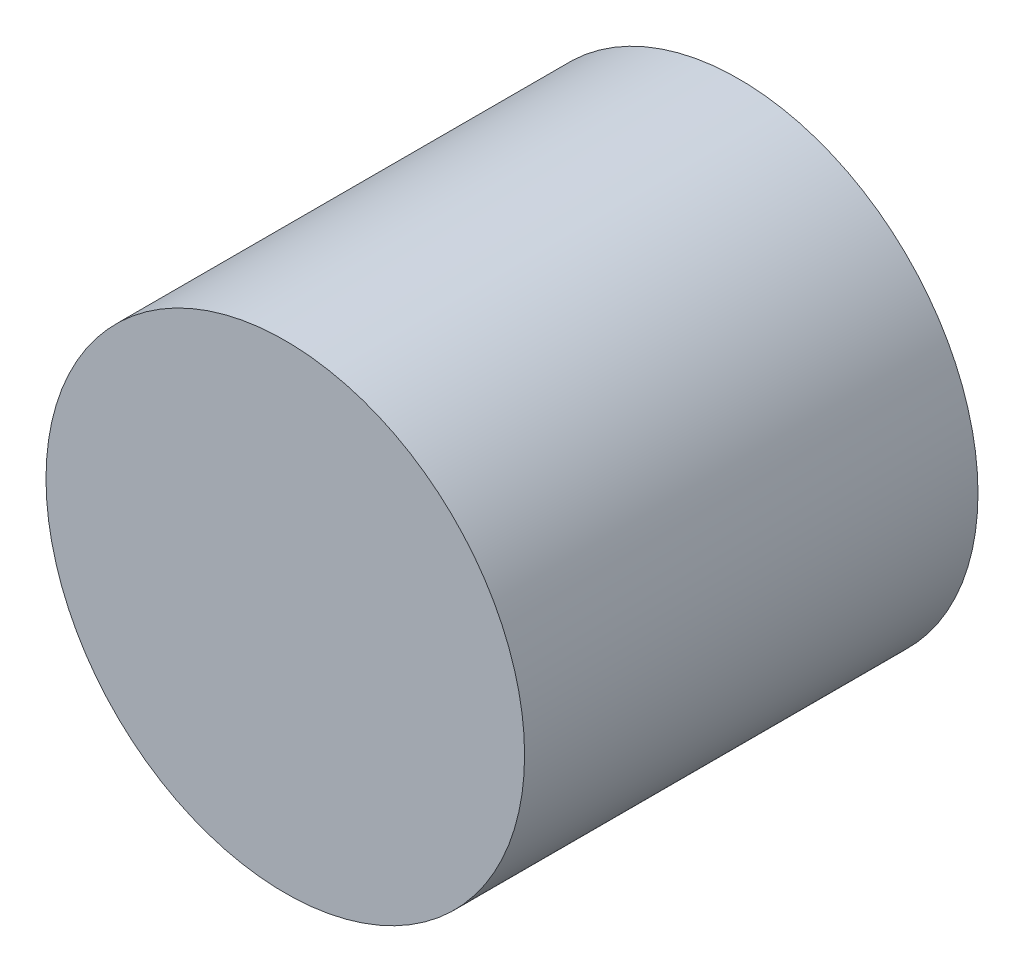
ISO-10303-21;
HEADER;
FILE_DESCRIPTION(('STEP AP214'),'2;1');
FILE_NAME('part.step','',(''),(''),'','','');
FILE_SCHEMA(('AUTOMOTIVE_DESIGN { 1 0 10303 214 1 1 1 1 }'));
ENDSEC;
DATA;
#1=APPLICATION_CONTEXT('core data for automotive mechanical design processes');
#2=APPLICATION_PROTOCOL_DEFINITION('international standard','automotive_design',2000,#1);
#3=PRODUCT_CONTEXT('',#1,'mechanical');
#4=PRODUCT('Part','Part','',(#3));
#5=PRODUCT_RELATED_PRODUCT_CATEGORY('part','',(#4));
#6=PRODUCT_DEFINITION_FORMATION('','',#4);
#7=PRODUCT_DEFINITION_CONTEXT('part definition',#1,'design');
#8=PRODUCT_DEFINITION('design','',#6,#7);
#9=PRODUCT_DEFINITION_SHAPE('','',#8);
#10=(LENGTH_UNIT() NAMED_UNIT(*) SI_UNIT(.MILLI.,.METRE.));
#11=(NAMED_UNIT(*) PLANE_ANGLE_UNIT() SI_UNIT($,.RADIAN.));
#12=(NAMED_UNIT(*) SI_UNIT($,.STERADIAN.) SOLID_ANGLE_UNIT());
#13=UNCERTAINTY_MEASURE_WITH_UNIT(LENGTH_MEASURE(1.E-05),#10,'distance_accuracy_value','');
#14=(GEOMETRIC_REPRESENTATION_CONTEXT(3) GLOBAL_UNCERTAINTY_ASSIGNED_CONTEXT((#13)) GLOBAL_UNIT_ASSIGNED_CONTEXT((#10,
#11,#12)) REPRESENTATION_CONTEXT('',''));
#15=CARTESIAN_POINT('',(0.,0.,0.));
#16=DIRECTION('',(0.,0.,1.));
#17=DIRECTION('',(1.,0.,0.));
#18=AXIS2_PLACEMENT_3D('',#15,#16,#17);
#19=CARTESIAN_POINT('',(0.,0.,72.));
#20=DIRECTION('',(0.,0.,-1.));
#21=DIRECTION('',(-1.,0.,0.));
#22=AXIS2_PLACEMENT_3D('',#19,#20,#21);
#23=CYLINDRICAL_SURFACE('',#22,57.);
#24=CARTESIAN_POINT('',(0.,0.,72.));
#25=DIRECTION('',(0.,0.,1.));
#26=DIRECTION('',(1.,0.,0.));
#27=AXIS2_PLACEMENT_3D('',#24,#25,#26);
#28=CIRCLE('',#27,57.);
#29=CARTESIAN_POINT('',(57.,0.,72.));
#30=VERTEX_POINT('',#29);
#31=EDGE_CURVE('E10',#30,#30,#28,.T.);
#32=ORIENTED_EDGE('',*,*,#31,.F.);
#33=EDGE_LOOP('',(#32));
#34=FACE_BOUND('',#33,.T.);
#35=CARTESIAN_POINT('',(0.,0.,-36.));
#36=DIRECTION('',(0.,0.,1.));
#37=DIRECTION('',(1.,0.,0.));
#38=AXIS2_PLACEMENT_3D('',#35,#36,#37);
#39=CIRCLE('',#38,57.);
#40=CARTESIAN_POINT('',(57.,0.,-36.));
#41=VERTEX_POINT('',#40);
#42=EDGE_CURVE('E40',#41,#41,#39,.T.);
#43=ORIENTED_EDGE('',*,*,#42,.T.);
#44=EDGE_LOOP('',(#43));
#45=FACE_BOUND('',#44,.T.);
#46=ADVANCED_FACE('F37',(#34,#45),#23,.T.);
#47=CARTESIAN_POINT('',(0.,0.,72.));
#48=DIRECTION('',(0.,0.,1.));
#49=DIRECTION('',(1.,0.,0.));
#50=AXIS2_PLACEMENT_3D('',#47,#48,#49);
#51=PLANE('',#50);
#52=ORIENTED_EDGE('',*,*,#31,.T.);
#53=EDGE_LOOP('',(#52));
#54=FACE_BOUND('',#53,.T.);
#55=ADVANCED_FACE('F52',(#54),#51,.T.);
#56=CARTESIAN_POINT('',(0.,0.,-36.));
#57=DIRECTION('',(0.,0.,1.));
#58=DIRECTION('',(1.,0.,0.));
#59=AXIS2_PLACEMENT_3D('',#56,#57,#58);
#60=PLANE('',#59);
#61=ORIENTED_EDGE('',*,*,#42,.F.);
#62=EDGE_LOOP('',(#61));
#63=FACE_BOUND('',#62,.T.);
#64=ADVANCED_FACE('F50',(#63),#60,.F.);
#65=CLOSED_SHELL('',(#46,#55,#64));
#66=MANIFOLD_SOLID_BREP('B2',#65);
#67=ADVANCED_BREP_SHAPE_REPRESENTATION('',(#18,#66),#14);
#68=SHAPE_DEFINITION_REPRESENTATION(#9,#67);
ENDSEC;
END-ISO-10303-21;
